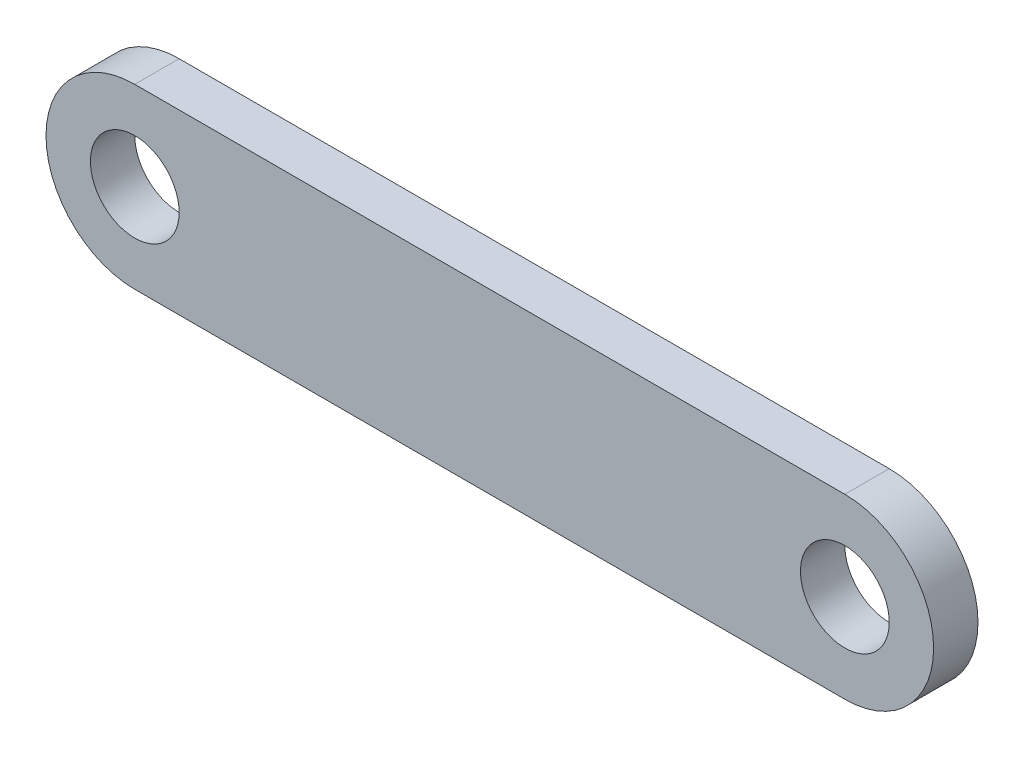
ISO-10303-21;
HEADER;
FILE_DESCRIPTION(('STEP AP214'),'2;1');
FILE_NAME('part.step','',(''),(''),'','','');
FILE_SCHEMA(('AUTOMOTIVE_DESIGN { 1 0 10303 214 1 1 1 1 }'));
ENDSEC;
DATA;
#1=APPLICATION_CONTEXT('core data for automotive mechanical design processes');
#2=APPLICATION_PROTOCOL_DEFINITION('international standard','automotive_design',2000,#1);
#3=PRODUCT_CONTEXT('',#1,'mechanical');
#4=PRODUCT('Part','Part','',(#3));
#5=PRODUCT_RELATED_PRODUCT_CATEGORY('part','',(#4));
#6=PRODUCT_DEFINITION_FORMATION('','',#4);
#7=PRODUCT_DEFINITION_CONTEXT('part definition',#1,'design');
#8=PRODUCT_DEFINITION('design','',#6,#7);
#9=PRODUCT_DEFINITION_SHAPE('','',#8);
#10=(LENGTH_UNIT() NAMED_UNIT(*) SI_UNIT(.MILLI.,.METRE.));
#11=(NAMED_UNIT(*) PLANE_ANGLE_UNIT() SI_UNIT($,.RADIAN.));
#12=(NAMED_UNIT(*) SI_UNIT($,.STERADIAN.) SOLID_ANGLE_UNIT());
#13=UNCERTAINTY_MEASURE_WITH_UNIT(LENGTH_MEASURE(1.E-05),#10,'distance_accuracy_value','');
#14=(GEOMETRIC_REPRESENTATION_CONTEXT(3) GLOBAL_UNCERTAINTY_ASSIGNED_CONTEXT((#13)) GLOBAL_UNIT_ASSIGNED_CONTEXT((#10,
#11,#12)) REPRESENTATION_CONTEXT('',''));
#15=CARTESIAN_POINT('',(0.,0.,0.));
#16=DIRECTION('',(0.,0.,1.));
#17=DIRECTION('',(1.,0.,0.));
#18=AXIS2_PLACEMENT_3D('',#15,#16,#17);
#19=CARTESIAN_POINT('',(0.,0.,1.));
#20=DIRECTION('',(0.,0.,1.));
#21=DIRECTION('',(1.,0.,0.));
#22=AXIS2_PLACEMENT_3D('',#19,#20,#21);
#23=PLANE('',#22);
#24=CARTESIAN_POINT('',(0.,0.,1.));
#25=DIRECTION('',(0.,0.,1.));
#26=DIRECTION('',(1.,0.,0.));
#27=AXIS2_PLACEMENT_3D('',#24,#25,#26);
#28=CIRCLE('',#27,2.);
#29=CARTESIAN_POINT('',(2.,0.,1.));
#30=VERTEX_POINT('',#29);
#31=EDGE_CURVE('E100',#30,#30,#28,.T.);
#32=ORIENTED_EDGE('',*,*,#31,.F.);
#33=EDGE_LOOP('',(#32));
#34=FACE_BOUND('',#33,.T.);
#35=CARTESIAN_POINT('',(0.,0.,1.));
#36=DIRECTION('',(0.,0.,1.));
#37=DIRECTION('',(1.,0.,0.));
#38=AXIS2_PLACEMENT_3D('',#35,#36,#37);
#39=CIRCLE('',#38,4.);
#40=CARTESIAN_POINT('',(0.,4.,1.));
#41=VERTEX_POINT('',#40);
#42=CARTESIAN_POINT('',(0.,-4.,1.));
#43=VERTEX_POINT('',#42);
#44=EDGE_CURVE('E85',#41,#43,#39,.T.);
#45=ORIENTED_EDGE('',*,*,#44,.T.);
#46=DIRECTION('',(1.,0.,0.));
#47=VECTOR('',#46,1.);
#48=CARTESIAN_POINT('',(0.,-4.,1.));
#49=LINE('',#48,#47);
#50=CARTESIAN_POINT('',(32.,-4.,1.));
#51=VERTEX_POINT('',#50);
#52=EDGE_CURVE('E80',#43,#51,#49,.T.);
#53=ORIENTED_EDGE('',*,*,#52,.T.);
#54=CARTESIAN_POINT('',(32.,0.,1.));
#55=DIRECTION('',(0.,0.,1.));
#56=DIRECTION('',(1.,0.,0.));
#57=AXIS2_PLACEMENT_3D('',#54,#55,#56);
#58=CIRCLE('',#57,4.);
#59=CARTESIAN_POINT('',(32.,4.,1.));
#60=VERTEX_POINT('',#59);
#61=EDGE_CURVE('E83',#51,#60,#58,.T.);
#62=ORIENTED_EDGE('',*,*,#61,.T.);
#63=DIRECTION('',(-1.,0.,0.));
#64=VECTOR('',#63,1.);
#65=CARTESIAN_POINT('',(0.,4.,1.));
#66=LINE('',#65,#64);
#67=EDGE_CURVE('E50',#60,#41,#66,.T.);
#68=ORIENTED_EDGE('',*,*,#67,.T.);
#69=EDGE_LOOP('',(#45,#53,#62,#68));
#70=FACE_BOUND('',#69,.T.);
#71=CARTESIAN_POINT('',(32.,0.,1.));
#72=DIRECTION('',(0.,0.,1.));
#73=DIRECTION('',(1.,0.,0.));
#74=AXIS2_PLACEMENT_3D('',#71,#72,#73);
#75=CIRCLE('',#74,2.);
#76=CARTESIAN_POINT('',(34.,0.,1.));
#77=VERTEX_POINT('',#76);
#78=EDGE_CURVE('E115',#77,#77,#75,.T.);
#79=ORIENTED_EDGE('',*,*,#78,.F.);
#80=EDGE_LOOP('',(#79));
#81=FACE_BOUND('',#80,.T.);
#82=ADVANCED_FACE('F33',(#34,#70,#81),#23,.T.);
#83=CARTESIAN_POINT('',(0.,0.,-1.));
#84=DIRECTION('',(0.,0.,1.));
#85=DIRECTION('',(1.,0.,0.));
#86=AXIS2_PLACEMENT_3D('',#83,#84,#85);
#87=PLANE('',#86);
#88=CARTESIAN_POINT('',(0.,0.,-1.));
#89=DIRECTION('',(0.,0.,1.));
#90=DIRECTION('',(1.,0.,0.));
#91=AXIS2_PLACEMENT_3D('',#88,#89,#90);
#92=CIRCLE('',#91,4.);
#93=CARTESIAN_POINT('',(0.,4.,-1.));
#94=VERTEX_POINT('',#93);
#95=CARTESIAN_POINT('',(0.,-4.,-1.));
#96=VERTEX_POINT('',#95);
#97=EDGE_CURVE('E97',#94,#96,#92,.T.);
#98=ORIENTED_EDGE('',*,*,#97,.F.);
#99=DIRECTION('',(-1.,0.,0.));
#100=VECTOR('',#99,1.);
#101=CARTESIAN_POINT('',(0.,4.,-1.));
#102=LINE('',#101,#100);
#103=CARTESIAN_POINT('',(32.,4.,-1.));
#104=VERTEX_POINT('',#103);
#105=EDGE_CURVE('E73',#104,#94,#102,.T.);
#106=ORIENTED_EDGE('',*,*,#105,.F.);
#107=CARTESIAN_POINT('',(32.,0.,-1.));
#108=DIRECTION('',(0.,0.,1.));
#109=DIRECTION('',(1.,0.,0.));
#110=AXIS2_PLACEMENT_3D('',#107,#108,#109);
#111=CIRCLE('',#110,4.);
#112=CARTESIAN_POINT('',(32.,-4.,-1.));
#113=VERTEX_POINT('',#112);
#114=EDGE_CURVE('E67',#113,#104,#111,.T.);
#115=ORIENTED_EDGE('',*,*,#114,.F.);
#116=DIRECTION('',(1.,0.,0.));
#117=VECTOR('',#116,1.);
#118=CARTESIAN_POINT('',(0.,-4.,-1.));
#119=LINE('',#118,#117);
#120=EDGE_CURVE('E89',#96,#113,#119,.T.);
#121=ORIENTED_EDGE('',*,*,#120,.F.);
#122=EDGE_LOOP('',(#98,#106,#115,#121));
#123=FACE_BOUND('',#122,.T.);
#124=CARTESIAN_POINT('',(0.,0.,-1.));
#125=DIRECTION('',(0.,0.,1.));
#126=DIRECTION('',(1.,0.,0.));
#127=AXIS2_PLACEMENT_3D('',#124,#125,#126);
#128=CIRCLE('',#127,2.);
#129=CARTESIAN_POINT('',(2.,0.,-1.));
#130=VERTEX_POINT('',#129);
#131=EDGE_CURVE('E112',#130,#130,#128,.T.);
#132=ORIENTED_EDGE('',*,*,#131,.T.);
#133=EDGE_LOOP('',(#132));
#134=FACE_BOUND('',#133,.T.);
#135=CARTESIAN_POINT('',(32.,0.,-1.));
#136=DIRECTION('',(0.,0.,1.));
#137=DIRECTION('',(1.,0.,0.));
#138=AXIS2_PLACEMENT_3D('',#135,#136,#137);
#139=CIRCLE('',#138,2.);
#140=CARTESIAN_POINT('',(34.,0.,-1.));
#141=VERTEX_POINT('',#140);
#142=EDGE_CURVE('E118',#141,#141,#139,.T.);
#143=ORIENTED_EDGE('',*,*,#142,.T.);
#144=EDGE_LOOP('',(#143));
#145=FACE_BOUND('',#144,.T.);
#146=ADVANCED_FACE('F108',(#123,#134,#145),#87,.F.);
#147=CARTESIAN_POINT('',(0.,0.,1.));
#148=DIRECTION('',(0.,0.,-1.));
#149=DIRECTION('',(-1.,0.,0.));
#150=AXIS2_PLACEMENT_3D('',#147,#148,#149);
#151=CYLINDRICAL_SURFACE('',#150,4.);
#152=ORIENTED_EDGE('',*,*,#97,.T.);
#153=DIRECTION('',(0.,0.,-1.));
#154=VECTOR('',#153,1.);
#155=CARTESIAN_POINT('',(0.,-4.,1.));
#156=LINE('',#155,#154);
#157=EDGE_CURVE('E11',#43,#96,#156,.T.);
#158=ORIENTED_EDGE('',*,*,#157,.F.);
#159=ORIENTED_EDGE('',*,*,#44,.F.);
#160=DIRECTION('',(0.,0.,-1.));
#161=VECTOR('',#160,1.);
#162=CARTESIAN_POINT('',(0.,4.,1.));
#163=LINE('',#162,#161);
#164=EDGE_CURVE('E93',#41,#94,#163,.T.);
#165=ORIENTED_EDGE('',*,*,#164,.T.);
#166=EDGE_LOOP('',(#152,#158,#159,#165));
#167=FACE_BOUND('',#166,.T.);
#168=ADVANCED_FACE('F35',(#167),#151,.T.);
#169=CARTESIAN_POINT('',(0.,-4.,1.));
#170=DIRECTION('',(0.,1.,0.));
#171=DIRECTION('',(0.,0.,1.));
#172=AXIS2_PLACEMENT_3D('',#169,#170,#171);
#173=PLANE('',#172);
#174=ORIENTED_EDGE('',*,*,#120,.T.);
#175=DIRECTION('',(0.,0.,-1.));
#176=VECTOR('',#175,1.);
#177=CARTESIAN_POINT('',(32.,-4.,1.));
#178=LINE('',#177,#176);
#179=EDGE_CURVE('E42',#51,#113,#178,.T.);
#180=ORIENTED_EDGE('',*,*,#179,.F.);
#181=ORIENTED_EDGE('',*,*,#52,.F.);
#182=ORIENTED_EDGE('',*,*,#157,.T.);
#183=EDGE_LOOP('',(#174,#180,#181,#182));
#184=FACE_BOUND('',#183,.T.);
#185=ADVANCED_FACE('F88',(#184),#173,.F.);
#186=CARTESIAN_POINT('',(32.,0.,1.));
#187=DIRECTION('',(0.,0.,-1.));
#188=DIRECTION('',(-1.,0.,0.));
#189=AXIS2_PLACEMENT_3D('',#186,#187,#188);
#190=CYLINDRICAL_SURFACE('',#189,4.);
#191=ORIENTED_EDGE('',*,*,#114,.T.);
#192=DIRECTION('',(0.,0.,-1.));
#193=VECTOR('',#192,1.);
#194=CARTESIAN_POINT('',(32.,4.,1.));
#195=LINE('',#194,#193);
#196=EDGE_CURVE('E90',#60,#104,#195,.T.);
#197=ORIENTED_EDGE('',*,*,#196,.F.);
#198=ORIENTED_EDGE('',*,*,#61,.F.);
#199=ORIENTED_EDGE('',*,*,#179,.T.);
#200=EDGE_LOOP('',(#191,#197,#198,#199));
#201=FACE_BOUND('',#200,.T.);
#202=ADVANCED_FACE('F91',(#201),#190,.T.);
#203=CARTESIAN_POINT('',(0.,4.,1.));
#204=DIRECTION('',(0.,-1.,0.));
#205=DIRECTION('',(0.,0.,-1.));
#206=AXIS2_PLACEMENT_3D('',#203,#204,#205);
#207=PLANE('',#206);
#208=ORIENTED_EDGE('',*,*,#105,.T.);
#209=ORIENTED_EDGE('',*,*,#164,.F.);
#210=ORIENTED_EDGE('',*,*,#67,.F.);
#211=ORIENTED_EDGE('',*,*,#196,.T.);
#212=EDGE_LOOP('',(#208,#209,#210,#211));
#213=FACE_BOUND('',#212,.T.);
#214=ADVANCED_FACE('F105',(#213),#207,.F.);
#215=CARTESIAN_POINT('',(0.,0.,1.));
#216=DIRECTION('',(0.,0.,-1.));
#217=DIRECTION('',(-1.,0.,0.));
#218=AXIS2_PLACEMENT_3D('',#215,#216,#217);
#219=CYLINDRICAL_SURFACE('',#218,2.);
#220=ORIENTED_EDGE('',*,*,#31,.T.);
#221=EDGE_LOOP('',(#220));
#222=FACE_BOUND('',#221,.T.);
#223=ORIENTED_EDGE('',*,*,#131,.F.);
#224=EDGE_LOOP('',(#223));
#225=FACE_BOUND('',#224,.T.);
#226=ADVANCED_FACE('F135',(#222,#225),#219,.F.);
#227=CARTESIAN_POINT('',(32.,0.,1.));
#228=DIRECTION('',(0.,0.,-1.));
#229=DIRECTION('',(-1.,0.,0.));
#230=AXIS2_PLACEMENT_3D('',#227,#228,#229);
#231=CYLINDRICAL_SURFACE('',#230,2.);
#232=ORIENTED_EDGE('',*,*,#78,.T.);
#233=EDGE_LOOP('',(#232));
#234=FACE_BOUND('',#233,.T.);
#235=ORIENTED_EDGE('',*,*,#142,.F.);
#236=EDGE_LOOP('',(#235));
#237=FACE_BOUND('',#236,.T.);
#238=ADVANCED_FACE('F124',(#234,#237),#231,.F.);
#239=CLOSED_SHELL('',(#82,#146,#168,#185,#202,#214,#226,#238));
#240=MANIFOLD_SOLID_BREP('B2',#239);
#241=ADVANCED_BREP_SHAPE_REPRESENTATION('',(#18,#240),#14);
#242=SHAPE_DEFINITION_REPRESENTATION(#9,#241);
ENDSEC;
END-ISO-10303-21;
